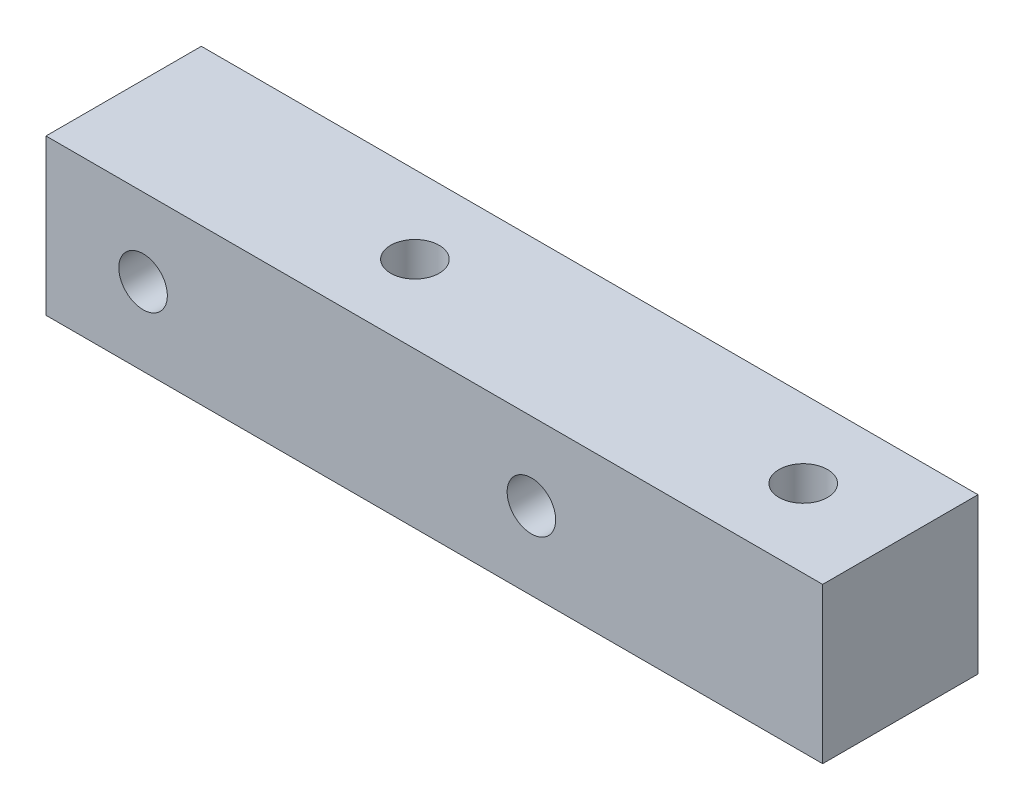
ISO-10303-21;
HEADER;
FILE_DESCRIPTION(('STEP AP214'),'2;1');
FILE_NAME('part.step','',(''),(''),'','','');
FILE_SCHEMA(('AUTOMOTIVE_DESIGN { 1 0 10303 214 1 1 1 1 }'));
ENDSEC;
DATA;
#1=APPLICATION_CONTEXT('core data for automotive mechanical design processes');
#2=APPLICATION_PROTOCOL_DEFINITION('international standard','automotive_design',2000,#1);
#3=PRODUCT_CONTEXT('',#1,'mechanical');
#4=PRODUCT('Part','Part','',(#3));
#5=PRODUCT_RELATED_PRODUCT_CATEGORY('part','',(#4));
#6=PRODUCT_DEFINITION_FORMATION('','',#4);
#7=PRODUCT_DEFINITION_CONTEXT('part definition',#1,'design');
#8=PRODUCT_DEFINITION('design','',#6,#7);
#9=PRODUCT_DEFINITION_SHAPE('','',#8);
#10=(LENGTH_UNIT() NAMED_UNIT(*) SI_UNIT(.MILLI.,.METRE.));
#11=(NAMED_UNIT(*) PLANE_ANGLE_UNIT() SI_UNIT($,.RADIAN.));
#12=(NAMED_UNIT(*) SI_UNIT($,.STERADIAN.) SOLID_ANGLE_UNIT());
#13=UNCERTAINTY_MEASURE_WITH_UNIT(LENGTH_MEASURE(1.E-05),#10,'distance_accuracy_value','');
#14=(GEOMETRIC_REPRESENTATION_CONTEXT(3) GLOBAL_UNCERTAINTY_ASSIGNED_CONTEXT((#13)) GLOBAL_UNIT_ASSIGNED_CONTEXT((#10,
#11,#12)) REPRESENTATION_CONTEXT('',''));
#15=CARTESIAN_POINT('',(0.,0.,0.));
#16=DIRECTION('',(0.,0.,1.));
#17=DIRECTION('',(1.,0.,0.));
#18=AXIS2_PLACEMENT_3D('',#15,#16,#17);
#19=CARTESIAN_POINT('',(-20.,-4.,8.));
#20=DIRECTION('',(1.,0.,0.));
#21=DIRECTION('',(0.,0.,-1.));
#22=AXIS2_PLACEMENT_3D('',#19,#20,#21);
#23=PLANE('',#22);
#24=DIRECTION('',(0.,-1.,0.));
#25=VECTOR('',#24,1.);
#26=CARTESIAN_POINT('',(-20.,-4.,0.));
#27=LINE('',#26,#25);
#28=CARTESIAN_POINT('',(-20.,4.,0.));
#29=VERTEX_POINT('',#28);
#30=CARTESIAN_POINT('',(-20.,-4.,0.));
#31=VERTEX_POINT('',#30);
#32=EDGE_CURVE('E107',#29,#31,#27,.T.);
#33=ORIENTED_EDGE('',*,*,#32,.T.);
#34=DIRECTION('',(0.,0.,-1.));
#35=VECTOR('',#34,1.);
#36=CARTESIAN_POINT('',(-20.,-4.,8.));
#37=LINE('',#36,#35);
#38=CARTESIAN_POINT('',(-20.,-4.,8.));
#39=VERTEX_POINT('',#38);
#40=EDGE_CURVE('E11',#39,#31,#37,.T.);
#41=ORIENTED_EDGE('',*,*,#40,.F.);
#42=DIRECTION('',(0.,-1.,0.));
#43=VECTOR('',#42,1.);
#44=CARTESIAN_POINT('',(-20.,-4.,8.));
#45=LINE('',#44,#43);
#46=CARTESIAN_POINT('',(-20.,4.,8.));
#47=VERTEX_POINT('',#46);
#48=EDGE_CURVE('E91',#47,#39,#45,.T.);
#49=ORIENTED_EDGE('',*,*,#48,.F.);
#50=DIRECTION('',(0.,0.,-1.));
#51=VECTOR('',#50,1.);
#52=CARTESIAN_POINT('',(-20.,4.,8.));
#53=LINE('',#52,#51);
#54=EDGE_CURVE('E103',#47,#29,#53,.T.);
#55=ORIENTED_EDGE('',*,*,#54,.T.);
#56=EDGE_LOOP('',(#33,#41,#49,#55));
#57=FACE_BOUND('',#56,.T.);
#58=ADVANCED_FACE('F39',(#57),#23,.F.);
#59=CARTESIAN_POINT('',(20.,-4.,8.));
#60=DIRECTION('',(0.,1.,0.));
#61=DIRECTION('',(-1.,0.,0.));
#62=AXIS2_PLACEMENT_3D('',#59,#60,#61);
#63=PLANE('',#62);
#64=CARTESIAN_POINT('',(-5.,-4.,4.));
#65=DIRECTION('',(0.,1.,0.));
#66=DIRECTION('',(0.,0.,1.));
#67=AXIS2_PLACEMENT_3D('',#64,#65,#66);
#68=CIRCLE('',#67,1.25);
#69=CARTESIAN_POINT('',(-5.,-4.,5.25));
#70=VERTEX_POINT('',#69);
#71=EDGE_CURVE('E151',#70,#70,#68,.T.);
#72=ORIENTED_EDGE('',*,*,#71,.T.);
#73=EDGE_LOOP('',(#72));
#74=FACE_BOUND('',#73,.T.);
#75=CARTESIAN_POINT('',(15.,-4.,4.));
#76=DIRECTION('',(0.,1.,0.));
#77=DIRECTION('',(0.,0.,1.));
#78=AXIS2_PLACEMENT_3D('',#75,#76,#77);
#79=CIRCLE('',#78,1.25);
#80=CARTESIAN_POINT('',(15.,-4.,5.25));
#81=VERTEX_POINT('',#80);
#82=EDGE_CURVE('E143',#81,#81,#79,.T.);
#83=ORIENTED_EDGE('',*,*,#82,.T.);
#84=EDGE_LOOP('',(#83));
#85=FACE_BOUND('',#84,.T.);
#86=DIRECTION('',(1.,0.,0.));
#87=VECTOR('',#86,1.);
#88=CARTESIAN_POINT('',(20.,-4.,0.));
#89=LINE('',#88,#87);
#90=CARTESIAN_POINT('',(20.,-4.,0.));
#91=VERTEX_POINT('',#90);
#92=EDGE_CURVE('E96',#31,#91,#89,.T.);
#93=ORIENTED_EDGE('',*,*,#92,.T.);
#94=DIRECTION('',(0.,0.,-1.));
#95=VECTOR('',#94,1.);
#96=CARTESIAN_POINT('',(20.,-4.,8.));
#97=LINE('',#96,#95);
#98=CARTESIAN_POINT('',(20.,-4.,8.));
#99=VERTEX_POINT('',#98);
#100=EDGE_CURVE('E48',#99,#91,#97,.T.);
#101=ORIENTED_EDGE('',*,*,#100,.F.);
#102=DIRECTION('',(1.,0.,0.));
#103=VECTOR('',#102,1.);
#104=CARTESIAN_POINT('',(20.,-4.,8.));
#105=LINE('',#104,#103);
#106=EDGE_CURVE('E86',#39,#99,#105,.T.);
#107=ORIENTED_EDGE('',*,*,#106,.F.);
#108=ORIENTED_EDGE('',*,*,#40,.T.);
#109=EDGE_LOOP('',(#93,#101,#107,#108));
#110=FACE_BOUND('',#109,.T.);
#111=ADVANCED_FACE('F95',(#74,#85,#110),#63,.F.);
#112=CARTESIAN_POINT('',(20.,-4.,8.));
#113=DIRECTION('',(-1.,0.,0.));
#114=DIRECTION('',(0.,0.,1.));
#115=AXIS2_PLACEMENT_3D('',#112,#113,#114);
#116=PLANE('',#115);
#117=DIRECTION('',(0.,1.,0.));
#118=VECTOR('',#117,1.);
#119=CARTESIAN_POINT('',(20.,-4.,0.));
#120=LINE('',#119,#118);
#121=CARTESIAN_POINT('',(20.,4.,0.));
#122=VERTEX_POINT('',#121);
#123=EDGE_CURVE('E73',#91,#122,#120,.T.);
#124=ORIENTED_EDGE('',*,*,#123,.T.);
#125=DIRECTION('',(0.,0.,-1.));
#126=VECTOR('',#125,1.);
#127=CARTESIAN_POINT('',(20.,4.,8.));
#128=LINE('',#127,#126);
#129=CARTESIAN_POINT('',(20.,4.,8.));
#130=VERTEX_POINT('',#129);
#131=EDGE_CURVE('E98',#130,#122,#128,.T.);
#132=ORIENTED_EDGE('',*,*,#131,.F.);
#133=DIRECTION('',(0.,1.,0.));
#134=VECTOR('',#133,1.);
#135=CARTESIAN_POINT('',(20.,-4.,8.));
#136=LINE('',#135,#134);
#137=EDGE_CURVE('E89',#99,#130,#136,.T.);
#138=ORIENTED_EDGE('',*,*,#137,.F.);
#139=ORIENTED_EDGE('',*,*,#100,.T.);
#140=EDGE_LOOP('',(#124,#132,#138,#139));
#141=FACE_BOUND('',#140,.T.);
#142=ADVANCED_FACE('F99',(#141),#116,.F.);
#143=CARTESIAN_POINT('',(20.,4.,8.));
#144=DIRECTION('',(0.,-1.,0.));
#145=DIRECTION('',(1.,0.,0.));
#146=AXIS2_PLACEMENT_3D('',#143,#144,#145);
#147=PLANE('',#146);
#148=CARTESIAN_POINT('',(-5.,4.,4.));
#149=DIRECTION('',(0.,1.,0.));
#150=DIRECTION('',(0.,0.,1.));
#151=AXIS2_PLACEMENT_3D('',#148,#149,#150);
#152=CIRCLE('',#151,1.25);
#153=CARTESIAN_POINT('',(-5.,4.,5.25));
#154=VERTEX_POINT('',#153);
#155=EDGE_CURVE('E155',#154,#154,#152,.T.);
#156=ORIENTED_EDGE('',*,*,#155,.F.);
#157=EDGE_LOOP('',(#156));
#158=FACE_BOUND('',#157,.T.);
#159=CARTESIAN_POINT('',(15.,4.,4.));
#160=DIRECTION('',(0.,1.,0.));
#161=DIRECTION('',(0.,0.,1.));
#162=AXIS2_PLACEMENT_3D('',#159,#160,#161);
#163=CIRCLE('',#162,1.25);
#164=CARTESIAN_POINT('',(15.,4.,5.25));
#165=VERTEX_POINT('',#164);
#166=EDGE_CURVE('E147',#165,#165,#163,.T.);
#167=ORIENTED_EDGE('',*,*,#166,.F.);
#168=EDGE_LOOP('',(#167));
#169=FACE_BOUND('',#168,.T.);
#170=DIRECTION('',(-1.,0.,0.));
#171=VECTOR('',#170,1.);
#172=CARTESIAN_POINT('',(20.,4.,0.));
#173=LINE('',#172,#171);
#174=EDGE_CURVE('E79',#122,#29,#173,.T.);
#175=ORIENTED_EDGE('',*,*,#174,.T.);
#176=ORIENTED_EDGE('',*,*,#54,.F.);
#177=DIRECTION('',(-1.,0.,0.));
#178=VECTOR('',#177,1.);
#179=CARTESIAN_POINT('',(20.,4.,8.));
#180=LINE('',#179,#178);
#181=EDGE_CURVE('E56',#130,#47,#180,.T.);
#182=ORIENTED_EDGE('',*,*,#181,.F.);
#183=ORIENTED_EDGE('',*,*,#131,.T.);
#184=EDGE_LOOP('',(#175,#176,#182,#183));
#185=FACE_BOUND('',#184,.T.);
#186=ADVANCED_FACE('F121',(#158,#169,#185),#147,.F.);
#187=CARTESIAN_POINT('',(0.,0.,8.));
#188=DIRECTION('',(0.,0.,1.));
#189=DIRECTION('',(1.,0.,0.));
#190=AXIS2_PLACEMENT_3D('',#187,#188,#189);
#191=PLANE('',#190);
#192=CARTESIAN_POINT('',(5.,0.,8.));
#193=DIRECTION('',(0.,0.,1.));
#194=DIRECTION('',(1.,0.,0.));
#195=AXIS2_PLACEMENT_3D('',#192,#193,#194);
#196=CIRCLE('',#195,1.25);
#197=CARTESIAN_POINT('',(6.25,0.,8.));
#198=VERTEX_POINT('',#197);
#199=EDGE_CURVE('E139',#198,#198,#196,.T.);
#200=ORIENTED_EDGE('',*,*,#199,.F.);
#201=EDGE_LOOP('',(#200));
#202=FACE_BOUND('',#201,.T.);
#203=CARTESIAN_POINT('',(-15.,0.,8.));
#204=DIRECTION('',(0.,0.,1.));
#205=DIRECTION('',(1.,0.,0.));
#206=AXIS2_PLACEMENT_3D('',#203,#204,#205);
#207=CIRCLE('',#206,1.25);
#208=CARTESIAN_POINT('',(-13.75,0.,8.));
#209=VERTEX_POINT('',#208);
#210=EDGE_CURVE('E131',#209,#209,#207,.T.);
#211=ORIENTED_EDGE('',*,*,#210,.F.);
#212=EDGE_LOOP('',(#211));
#213=FACE_BOUND('',#212,.T.);
#214=ORIENTED_EDGE('',*,*,#48,.T.);
#215=ORIENTED_EDGE('',*,*,#106,.T.);
#216=ORIENTED_EDGE('',*,*,#137,.T.);
#217=ORIENTED_EDGE('',*,*,#181,.T.);
#218=EDGE_LOOP('',(#214,#215,#216,#217));
#219=FACE_BOUND('',#218,.T.);
#220=ADVANCED_FACE('F87',(#202,#213,#219),#191,.T.);
#221=CARTESIAN_POINT('',(0.,0.,0.));
#222=DIRECTION('',(0.,0.,1.));
#223=DIRECTION('',(1.,0.,0.));
#224=AXIS2_PLACEMENT_3D('',#221,#222,#223);
#225=PLANE('',#224);
#226=CARTESIAN_POINT('',(5.,0.,0.));
#227=DIRECTION('',(0.,0.,1.));
#228=DIRECTION('',(1.,0.,0.));
#229=AXIS2_PLACEMENT_3D('',#226,#227,#228);
#230=CIRCLE('',#229,1.25);
#231=CARTESIAN_POINT('',(6.25,0.,0.));
#232=VERTEX_POINT('',#231);
#233=EDGE_CURVE('E135',#232,#232,#230,.T.);
#234=ORIENTED_EDGE('',*,*,#233,.T.);
#235=EDGE_LOOP('',(#234));
#236=FACE_BOUND('',#235,.T.);
#237=CARTESIAN_POINT('',(-15.,0.,0.));
#238=DIRECTION('',(0.,0.,1.));
#239=DIRECTION('',(1.,0.,0.));
#240=AXIS2_PLACEMENT_3D('',#237,#238,#239);
#241=CIRCLE('',#240,1.25);
#242=CARTESIAN_POINT('',(-13.75,0.,0.));
#243=VERTEX_POINT('',#242);
#244=EDGE_CURVE('E111',#243,#243,#241,.T.);
#245=ORIENTED_EDGE('',*,*,#244,.T.);
#246=EDGE_LOOP('',(#245));
#247=FACE_BOUND('',#246,.T.);
#248=ORIENTED_EDGE('',*,*,#32,.F.);
#249=ORIENTED_EDGE('',*,*,#174,.F.);
#250=ORIENTED_EDGE('',*,*,#123,.F.);
#251=ORIENTED_EDGE('',*,*,#92,.F.);
#252=EDGE_LOOP('',(#248,#249,#250,#251));
#253=FACE_BOUND('',#252,.T.);
#254=ADVANCED_FACE('F124',(#236,#247,#253),#225,.F.);
#255=CARTESIAN_POINT('',(-15.,0.,8.));
#256=DIRECTION('',(0.,0.,1.));
#257=DIRECTION('',(1.,0.,0.));
#258=AXIS2_PLACEMENT_3D('',#255,#256,#257);
#259=CYLINDRICAL_SURFACE('',#258,1.25);
#260=ORIENTED_EDGE('',*,*,#244,.F.);
#261=EDGE_LOOP('',(#260));
#262=FACE_BOUND('',#261,.T.);
#263=ORIENTED_EDGE('',*,*,#210,.T.);
#264=EDGE_LOOP('',(#263));
#265=FACE_BOUND('',#264,.T.);
#266=ADVANCED_FACE('F178',(#262,#265),#259,.F.);
#267=CARTESIAN_POINT('',(5.,0.,8.));
#268=DIRECTION('',(0.,0.,1.));
#269=DIRECTION('',(1.,0.,0.));
#270=AXIS2_PLACEMENT_3D('',#267,#268,#269);
#271=CYLINDRICAL_SURFACE('',#270,1.25);
#272=ORIENTED_EDGE('',*,*,#233,.F.);
#273=EDGE_LOOP('',(#272));
#274=FACE_BOUND('',#273,.T.);
#275=ORIENTED_EDGE('',*,*,#199,.T.);
#276=EDGE_LOOP('',(#275));
#277=FACE_BOUND('',#276,.T.);
#278=ADVANCED_FACE('F169',(#274,#277),#271,.F.);
#279=CARTESIAN_POINT('',(15.,4.,4.));
#280=DIRECTION('',(0.,1.,0.));
#281=DIRECTION('',(0.,0.,1.));
#282=AXIS2_PLACEMENT_3D('',#279,#280,#281);
#283=CYLINDRICAL_SURFACE('',#282,1.25);
#284=ORIENTED_EDGE('',*,*,#82,.F.);
#285=EDGE_LOOP('',(#284));
#286=FACE_BOUND('',#285,.T.);
#287=ORIENTED_EDGE('',*,*,#166,.T.);
#288=EDGE_LOOP('',(#287));
#289=FACE_BOUND('',#288,.T.);
#290=ADVANCED_FACE('F167',(#286,#289),#283,.F.);
#291=CARTESIAN_POINT('',(-5.,4.,4.));
#292=DIRECTION('',(0.,1.,0.));
#293=DIRECTION('',(0.,0.,1.));
#294=AXIS2_PLACEMENT_3D('',#291,#292,#293);
#295=CYLINDRICAL_SURFACE('',#294,1.25);
#296=ORIENTED_EDGE('',*,*,#71,.F.);
#297=EDGE_LOOP('',(#296));
#298=FACE_BOUND('',#297,.T.);
#299=ORIENTED_EDGE('',*,*,#155,.T.);
#300=EDGE_LOOP('',(#299));
#301=FACE_BOUND('',#300,.T.);
#302=ADVANCED_FACE('F160',(#298,#301),#295,.F.);
#303=CLOSED_SHELL('',(#58,#111,#142,#186,#220,#254,#266,#278,#290,#302));
#304=MANIFOLD_SOLID_BREP('B2',#303);
#305=ADVANCED_BREP_SHAPE_REPRESENTATION('',(#18,#304),#14);
#306=SHAPE_DEFINITION_REPRESENTATION(#9,#305);
ENDSEC;
END-ISO-10303-21;
